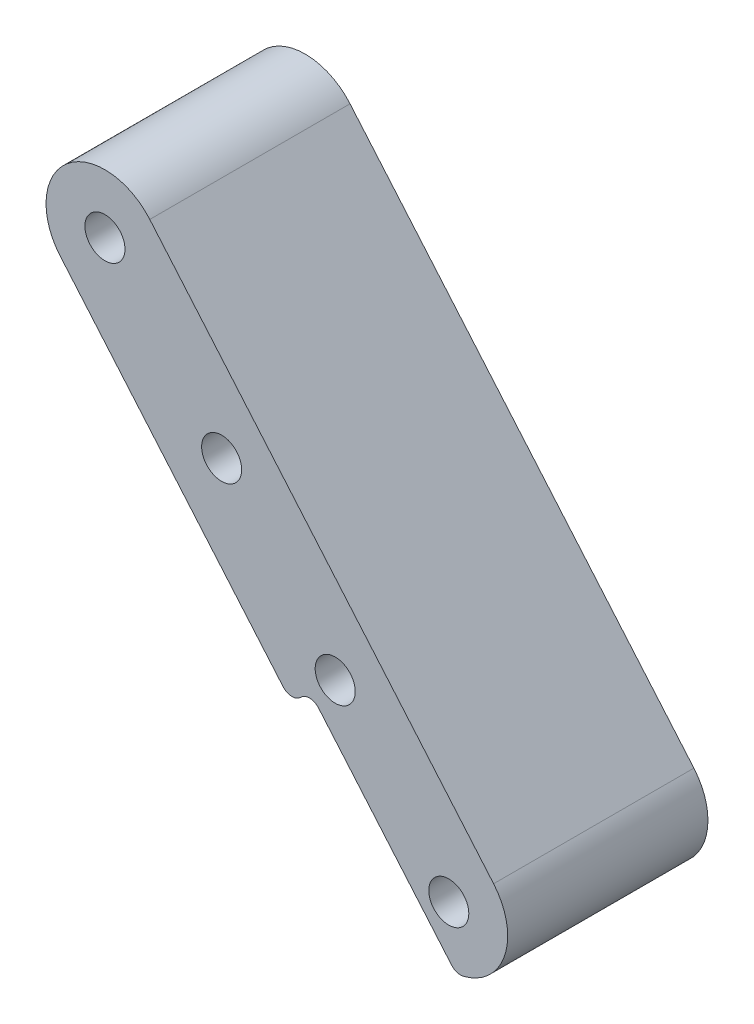
ISO-10303-21;
HEADER;
FILE_DESCRIPTION(('STEP AP214'),'2;1');
FILE_NAME('part.step','',(''),(''),'','','');
FILE_SCHEMA(('AUTOMOTIVE_DESIGN { 1 0 10303 214 1 1 1 1 }'));
ENDSEC;
DATA;
#1=APPLICATION_CONTEXT('core data for automotive mechanical design processes');
#2=APPLICATION_PROTOCOL_DEFINITION('international standard','automotive_design',2000,#1);
#3=PRODUCT_CONTEXT('',#1,'mechanical');
#4=PRODUCT('Part','Part','',(#3));
#5=PRODUCT_RELATED_PRODUCT_CATEGORY('part','',(#4));
#6=PRODUCT_DEFINITION_FORMATION('','',#4);
#7=PRODUCT_DEFINITION_CONTEXT('part definition',#1,'design');
#8=PRODUCT_DEFINITION('design','',#6,#7);
#9=PRODUCT_DEFINITION_SHAPE('','',#8);
#10=(LENGTH_UNIT() NAMED_UNIT(*) SI_UNIT(.MILLI.,.METRE.));
#11=(NAMED_UNIT(*) PLANE_ANGLE_UNIT() SI_UNIT($,.RADIAN.));
#12=(NAMED_UNIT(*) SI_UNIT($,.STERADIAN.) SOLID_ANGLE_UNIT());
#13=UNCERTAINTY_MEASURE_WITH_UNIT(LENGTH_MEASURE(1.E-05),#10,'distance_accuracy_value','');
#14=(GEOMETRIC_REPRESENTATION_CONTEXT(3) GLOBAL_UNCERTAINTY_ASSIGNED_CONTEXT((#13)) GLOBAL_UNIT_ASSIGNED_CONTEXT((#10,
#11,#12)) REPRESENTATION_CONTEXT('',''));
#15=CARTESIAN_POINT('',(0.,0.,0.));
#16=DIRECTION('',(0.,0.,1.));
#17=DIRECTION('',(1.,0.,0.));
#18=AXIS2_PLACEMENT_3D('',#15,#16,#17);
#19=CARTESIAN_POINT('',(-10.203207624469,-8.69654423782736,34.));
#20=DIRECTION('',(0.761061934171293,0.648679221461156,0.));
#21=DIRECTION('',(-0.648679221461156,0.761061934171293,0.));
#22=AXIS2_PLACEMENT_3D('',#19,#20,#21);
#23=PLANE('',#22);
#24=DIRECTION('',(0.648679221461156,-0.761061934171293,0.));
#25=VECTOR('',#24,1.);
#26=CARTESIAN_POINT('',(-10.203207624469,-8.69654423782736,0.));
#27=LINE('',#26,#25);
#28=CARTESIAN_POINT('',(26.1104587089052,-51.301499386963,0.));
#29=VERTEX_POINT('',#28);
#30=CARTESIAN_POINT('',(63.9584834494718,-95.7066382608978,0.));
#31=VERTEX_POINT('',#30);
#32=EDGE_CURVE('E177',#29,#31,#27,.T.);
#33=ORIENTED_EDGE('',*,*,#32,.T.);
#34=DIRECTION('',(0.,0.,1.));
#35=VECTOR('',#34,1.);
#36=CARTESIAN_POINT('',(63.9584834494718,-95.7066382608978,34.));
#37=LINE('',#36,#35);
#38=CARTESIAN_POINT('',(63.9584834494718,-95.7066382608978,34.));
#39=VERTEX_POINT('',#38);
#40=EDGE_CURVE('E144',#31,#39,#37,.T.);
#41=ORIENTED_EDGE('',*,*,#40,.T.);
#42=DIRECTION('',(0.648679221461156,-0.761061934171293,0.));
#43=VECTOR('',#42,1.);
#44=CARTESIAN_POINT('',(-10.203207624469,-8.69654423782736,34.));
#45=LINE('',#44,#43);
#46=CARTESIAN_POINT('',(26.1104587089052,-51.301499386963,34.));
#47=VERTEX_POINT('',#46);
#48=EDGE_CURVE('E134',#47,#39,#45,.T.);
#49=ORIENTED_EDGE('',*,*,#48,.F.);
#50=DIRECTION('',(0.,0.,-1.));
#51=VECTOR('',#50,1.);
#52=CARTESIAN_POINT('',(26.1104587089052,-51.301499386963,34.));
#53=LINE('',#52,#51);
#54=EDGE_CURVE('E156',#47,#29,#53,.T.);
#55=ORIENTED_EDGE('',*,*,#54,.T.);
#56=EDGE_LOOP('',(#33,#41,#49,#55));
#57=FACE_BOUND('',#56,.T.);
#58=ADVANCED_FACE('F49',(#57),#23,.F.);
#59=CARTESIAN_POINT('',(92.0987320713913,-113.30620314066,34.));
#60=DIRECTION('',(0.,0.,-1.));
#61=DIRECTION('',(-1.,0.,0.));
#62=AXIS2_PLACEMENT_3D('',#59,#60,#61);
#63=CYLINDRICAL_SURFACE('',#62,9.99999999999999);
#64=CARTESIAN_POINT('',(92.0987320713913,-113.30620314066,34.));
#65=DIRECTION('',(0.,0.,1.));
#66=DIRECTION('',(1.,0.,0.));
#67=AXIS2_PLACEMENT_3D('',#64,#65,#66);
#68=CIRCLE('',#67,9.99999999999999);
#69=CARTESIAN_POINT('',(94.6021290946444,-122.98778376285,34.));
#70=VERTEX_POINT('',#69);
#71=CARTESIAN_POINT('',(99.7093514131042,-106.819410926048,34.));
#72=VERTEX_POINT('',#71);
#73=EDGE_CURVE('E122',#70,#72,#68,.T.);
#74=ORIENTED_EDGE('',*,*,#73,.F.);
#75=DIRECTION('',(0.,0.,-1.));
#76=VECTOR('',#75,1.);
#77=CARTESIAN_POINT('',(94.6021290946444,-122.98778376285,34.));
#78=LINE('',#77,#76);
#79=CARTESIAN_POINT('',(94.6021290946444,-122.98778376285,0.));
#80=VERTEX_POINT('',#79);
#81=EDGE_CURVE('E219',#70,#80,#78,.T.);
#82=ORIENTED_EDGE('',*,*,#81,.T.);
#83=CARTESIAN_POINT('',(92.0987320713913,-113.30620314066,0.));
#84=DIRECTION('',(0.,0.,1.));
#85=DIRECTION('',(1.,0.,0.));
#86=AXIS2_PLACEMENT_3D('',#83,#84,#85);
#87=CIRCLE('',#86,9.99999999999999);
#88=CARTESIAN_POINT('',(99.7093514131042,-106.819410926048,0.));
#89=VERTEX_POINT('',#88);
#90=EDGE_CURVE('E139',#80,#89,#87,.T.);
#91=ORIENTED_EDGE('',*,*,#90,.T.);
#92=DIRECTION('',(0.,0.,-1.));
#93=VECTOR('',#92,1.);
#94=CARTESIAN_POINT('',(99.7093514131042,-106.819410926048,34.));
#95=LINE('',#94,#93);
#96=EDGE_CURVE('E137',#72,#89,#95,.T.);
#97=ORIENTED_EDGE('',*,*,#96,.F.);
#98=EDGE_LOOP('',(#74,#82,#91,#97));
#99=FACE_BOUND('',#98,.T.);
#100=ADVANCED_FACE('F138',(#99),#63,.T.);
#101=CARTESIAN_POINT('',(5.01803105895681,4.27704019139575,34.));
#102=DIRECTION('',(0.761061934171293,0.648679221461156,0.));
#103=DIRECTION('',(-0.648679221461156,0.761061934171293,0.));
#104=AXIS2_PLACEMENT_3D('',#101,#102,#103);
#105=PLANE('',#104);
#106=DIRECTION('',(0.648679221461156,-0.761061934171293,0.));
#107=VECTOR('',#106,1.);
#108=CARTESIAN_POINT('',(5.01803105895681,4.27704019139575,0.));
#109=LINE('',#108,#107);
#110=CARTESIAN_POINT('',(41.3316973923311,-38.3279149577399,0.));
#111=VERTEX_POINT('',#110);
#112=EDGE_CURVE('E182',#111,#89,#109,.T.);
#113=ORIENTED_EDGE('',*,*,#112,.F.);
#114=DIRECTION('',(0.,0.,-1.));
#115=VECTOR('',#114,1.);
#116=CARTESIAN_POINT('',(41.3316973923311,-38.3279149577399,34.));
#117=LINE('',#116,#115);
#118=CARTESIAN_POINT('',(41.3316973923311,-38.3279149577399,34.));
#119=VERTEX_POINT('',#118);
#120=EDGE_CURVE('E145',#119,#111,#117,.T.);
#121=ORIENTED_EDGE('',*,*,#120,.F.);
#122=DIRECTION('',(0.648679221461156,-0.761061934171293,0.));
#123=VECTOR('',#122,1.);
#124=CARTESIAN_POINT('',(5.01803105895681,4.27704019139575,34.));
#125=LINE('',#124,#123);
#126=EDGE_CURVE('E128',#119,#72,#125,.T.);
#127=ORIENTED_EDGE('',*,*,#126,.T.);
#128=ORIENTED_EDGE('',*,*,#96,.T.);
#129=EDGE_LOOP('',(#113,#121,#127,#128));
#130=FACE_BOUND('',#129,.T.);
#131=ADVANCED_FACE('F147',(#130),#105,.T.);
#132=CARTESIAN_POINT('',(33.7210780506182,-44.8147071723515,34.));
#133=DIRECTION('',(0.,0.,-1.));
#134=DIRECTION('',(-1.,0.,0.));
#135=AXIS2_PLACEMENT_3D('',#132,#133,#134);
#136=CYLINDRICAL_SURFACE('',#135,3.4);
#137=CARTESIAN_POINT('',(33.7210780506182,-44.8147071723515,34.));
#138=DIRECTION('',(0.,0.,1.));
#139=DIRECTION('',(1.,0.,0.));
#140=AXIS2_PLACEMENT_3D('',#137,#138,#139);
#141=CIRCLE('',#140,3.4);
#142=CARTESIAN_POINT('',(37.1210780506182,-44.8147071723515,34.));
#143=VERTEX_POINT('',#142);
#144=EDGE_CURVE('E262',#143,#143,#141,.T.);
#145=ORIENTED_EDGE('',*,*,#144,.T.);
#146=EDGE_LOOP('',(#145));
#147=FACE_BOUND('',#146,.T.);
#148=CARTESIAN_POINT('',(33.7210780506182,-44.8147071723515,0.));
#149=DIRECTION('',(0.,0.,1.));
#150=DIRECTION('',(1.,0.,0.));
#151=AXIS2_PLACEMENT_3D('',#148,#149,#150);
#152=CIRCLE('',#151,3.4);
#153=CARTESIAN_POINT('',(37.1210780506182,-44.8147071723515,0.));
#154=VERTEX_POINT('',#153);
#155=EDGE_CURVE('E173',#154,#154,#152,.T.);
#156=ORIENTED_EDGE('',*,*,#155,.F.);
#157=EDGE_LOOP('',(#156));
#158=FACE_BOUND('',#157,.T.);
#159=ADVANCED_FACE('F296',(#147,#158),#136,.F.);
#160=CARTESIAN_POINT('',(53.5314754901986,-67.3435365535214,34.));
#161=DIRECTION('',(0.,0.,-1.));
#162=DIRECTION('',(-1.,0.,0.));
#163=AXIS2_PLACEMENT_3D('',#160,#161,#162);
#164=CYLINDRICAL_SURFACE('',#163,3.4);
#165=CARTESIAN_POINT('',(53.5314754901986,-67.3435365535214,34.));
#166=DIRECTION('',(0.,0.,1.));
#167=DIRECTION('',(1.,0.,0.));
#168=AXIS2_PLACEMENT_3D('',#165,#166,#167);
#169=CIRCLE('',#168,3.4);
#170=CARTESIAN_POINT('',(56.9314754901986,-67.3435365535214,34.));
#171=VERTEX_POINT('',#170);
#172=EDGE_CURVE('E258',#171,#171,#169,.T.);
#173=ORIENTED_EDGE('',*,*,#172,.T.);
#174=EDGE_LOOP('',(#173));
#175=FACE_BOUND('',#174,.T.);
#176=CARTESIAN_POINT('',(53.5314754901986,-67.3435365535214,0.));
#177=DIRECTION('',(0.,0.,1.));
#178=DIRECTION('',(1.,0.,0.));
#179=AXIS2_PLACEMENT_3D('',#176,#177,#178);
#180=CIRCLE('',#179,3.4);
#181=CARTESIAN_POINT('',(56.9314754901986,-67.3435365535214,0.));
#182=VERTEX_POINT('',#181);
#183=EDGE_CURVE('E169',#182,#182,#180,.T.);
#184=ORIENTED_EDGE('',*,*,#183,.F.);
#185=EDGE_LOOP('',(#184));
#186=FACE_BOUND('',#185,.T.);
#187=ADVANCED_FACE('F299',(#175,#186),#164,.F.);
#188=CARTESIAN_POINT('',(92.0987320713913,-113.30620314066,34.));
#189=DIRECTION('',(0.,0.,-1.));
#190=DIRECTION('',(-1.,0.,0.));
#191=AXIS2_PLACEMENT_3D('',#188,#189,#190);
#192=CYLINDRICAL_SURFACE('',#191,3.4);
#193=CARTESIAN_POINT('',(92.0987320713913,-113.30620314066,34.));
#194=DIRECTION('',(0.,0.,1.));
#195=DIRECTION('',(1.,0.,0.));
#196=AXIS2_PLACEMENT_3D('',#193,#194,#195);
#197=CIRCLE('',#196,3.4);
#198=CARTESIAN_POINT('',(95.4987320713913,-113.30620314066,34.));
#199=VERTEX_POINT('',#198);
#200=EDGE_CURVE('E254',#199,#199,#197,.T.);
#201=ORIENTED_EDGE('',*,*,#200,.T.);
#202=EDGE_LOOP('',(#201));
#203=FACE_BOUND('',#202,.T.);
#204=CARTESIAN_POINT('',(92.0987320713913,-113.30620314066,0.));
#205=DIRECTION('',(0.,0.,1.));
#206=DIRECTION('',(1.,0.,0.));
#207=AXIS2_PLACEMENT_3D('',#204,#205,#206);
#208=CIRCLE('',#207,3.4);
#209=CARTESIAN_POINT('',(95.4987320713913,-113.30620314066,0.));
#210=VERTEX_POINT('',#209);
#211=EDGE_CURVE('E164',#210,#210,#208,.T.);
#212=ORIENTED_EDGE('',*,*,#211,.F.);
#213=EDGE_LOOP('',(#212));
#214=FACE_BOUND('',#213,.T.);
#215=ADVANCED_FACE('F284',(#203,#214),#192,.F.);
#216=CARTESIAN_POINT('',(72.8151037807949,-90.3248698470906,34.));
#217=DIRECTION('',(0.,0.,-1.));
#218=DIRECTION('',(-1.,0.,0.));
#219=AXIS2_PLACEMENT_3D('',#216,#217,#218);
#220=CYLINDRICAL_SURFACE('',#219,3.4);
#221=CARTESIAN_POINT('',(72.8151037807949,-90.3248698470906,34.));
#222=DIRECTION('',(0.,0.,1.));
#223=DIRECTION('',(1.,0.,0.));
#224=AXIS2_PLACEMENT_3D('',#221,#222,#223);
#225=CIRCLE('',#224,3.4);
#226=CARTESIAN_POINT('',(76.2151037807949,-90.3248698470906,34.));
#227=VERTEX_POINT('',#226);
#228=EDGE_CURVE('E188',#227,#227,#225,.T.);
#229=ORIENTED_EDGE('',*,*,#228,.T.);
#230=EDGE_LOOP('',(#229));
#231=FACE_BOUND('',#230,.T.);
#232=CARTESIAN_POINT('',(72.8151037807949,-90.3248698470906,0.));
#233=DIRECTION('',(0.,0.,1.));
#234=DIRECTION('',(1.,0.,0.));
#235=AXIS2_PLACEMENT_3D('',#232,#233,#234);
#236=CIRCLE('',#235,3.4);
#237=CARTESIAN_POINT('',(76.2151037807949,-90.3248698470906,0.));
#238=VERTEX_POINT('',#237);
#239=EDGE_CURVE('E160',#238,#238,#236,.T.);
#240=ORIENTED_EDGE('',*,*,#239,.F.);
#241=EDGE_LOOP('',(#240));
#242=FACE_BOUND('',#241,.T.);
#243=ADVANCED_FACE('F277',(#231,#242),#220,.F.);
#244=CARTESIAN_POINT('',(33.7210780506182,-44.8147071723515,34.));
#245=DIRECTION('',(0.,0.,-1.));
#246=DIRECTION('',(-1.,0.,0.));
#247=AXIS2_PLACEMENT_3D('',#244,#245,#246);
#248=CYLINDRICAL_SURFACE('',#247,10.);
#249=CARTESIAN_POINT('',(33.7210780506182,-44.8147071723515,0.));
#250=DIRECTION('',(0.,0.,1.));
#251=DIRECTION('',(1.,0.,0.));
#252=AXIS2_PLACEMENT_3D('',#249,#250,#251);
#253=CIRCLE('',#252,10.);
#254=EDGE_CURVE('E185',#111,#29,#253,.T.);
#255=ORIENTED_EDGE('',*,*,#254,.T.);
#256=ORIENTED_EDGE('',*,*,#54,.F.);
#257=CARTESIAN_POINT('',(33.7210780506182,-44.8147071723515,34.));
#258=DIRECTION('',(0.,0.,1.));
#259=DIRECTION('',(1.,0.,0.));
#260=AXIS2_PLACEMENT_3D('',#257,#258,#259);
#261=CIRCLE('',#260,10.);
#262=EDGE_CURVE('E150',#119,#47,#261,.T.);
#263=ORIENTED_EDGE('',*,*,#262,.F.);
#264=ORIENTED_EDGE('',*,*,#120,.T.);
#265=EDGE_LOOP('',(#255,#256,#263,#264));
#266=FACE_BOUND('',#265,.T.);
#267=ADVANCED_FACE('F275',(#266),#248,.T.);
#268=CARTESIAN_POINT('',(0.,0.,34.));
#269=DIRECTION('',(0.,0.,1.));
#270=DIRECTION('',(1.,0.,0.));
#271=AXIS2_PLACEMENT_3D('',#268,#269,#270);
#272=PLANE('',#271);
#273=ORIENTED_EDGE('',*,*,#48,.T.);
#274=CARTESIAN_POINT('',(65.4806073178143,-94.4092798179755,34.));
#275=DIRECTION('',(0.,0.,1.));
#276=DIRECTION('',(1.,0.,0.));
#277=AXIS2_PLACEMENT_3D('',#274,#275,#276);
#278=CIRCLE('',#277,2.);
#279=CARTESIAN_POINT('',(66.7779657607367,-95.9314036863181,34.));
#280=VERTEX_POINT('',#279);
#281=EDGE_CURVE('E198',#39,#280,#278,.T.);
#282=ORIENTED_EDGE('',*,*,#281,.T.);
#283=DIRECTION('',(-0.761061934171288,-0.648679221461162,0.));
#284=VECTOR('',#283,1.);
#285=CARTESIAN_POINT('',(75.4590495168638,-88.5322178914124,34.));
#286=LINE('',#285,#284);
#287=CARTESIAN_POINT('',(67.1584967278223,-95.6070640755875,34.));
#288=VERTEX_POINT('',#287);
#289=EDGE_CURVE('E227',#288,#280,#286,.T.);
#290=ORIENTED_EDGE('',*,*,#289,.F.);
#291=CARTESIAN_POINT('',(68.4558551707446,-97.1291879439301,34.));
#292=DIRECTION('',(0.,0.,1.));
#293=DIRECTION('',(1.,0.,0.));
#294=AXIS2_PLACEMENT_3D('',#291,#292,#293);
#295=CIRCLE('',#294,2.);
#296=CARTESIAN_POINT('',(69.9779790390872,-95.8318295010078,34.));
#297=VERTEX_POINT('',#296);
#298=EDGE_CURVE('E58',#288,#297,#295,.F.);
#299=ORIENTED_EDGE('',*,*,#298,.T.);
#300=DIRECTION('',(-0.648679221461155,0.761061934171293,0.));
#301=VECTOR('',#300,1.);
#302=CARTESIAN_POINT('',(-6.77842892069819,-5.77748774125213,34.));
#303=LINE('',#302,#301);
#304=CARTESIAN_POINT('',(92.5793258216512,-122.348826081334,34.));
#305=VERTEX_POINT('',#304);
#306=EDGE_CURVE('E225',#305,#297,#303,.T.);
#307=ORIENTED_EDGE('',*,*,#306,.F.);
#308=CARTESIAN_POINT('',(94.1014496899938,-121.051467638412,34.));
#309=DIRECTION('',(0.,0.,1.));
#310=DIRECTION('',(1.,0.,0.));
#311=AXIS2_PLACEMENT_3D('',#308,#309,#310);
#312=CIRCLE('',#311,2.);
#313=EDGE_CURVE('E130',#305,#70,#312,.T.);
#314=ORIENTED_EDGE('',*,*,#313,.T.);
#315=ORIENTED_EDGE('',*,*,#73,.T.);
#316=ORIENTED_EDGE('',*,*,#126,.F.);
#317=ORIENTED_EDGE('',*,*,#262,.T.);
#318=EDGE_LOOP('',(#273,#282,#290,#299,#307,#314,#315,#316,#317));
#319=FACE_BOUND('',#318,.T.);
#320=ORIENTED_EDGE('',*,*,#228,.F.);
#321=EDGE_LOOP('',(#320));
#322=FACE_BOUND('',#321,.T.);
#323=ORIENTED_EDGE('',*,*,#200,.F.);
#324=EDGE_LOOP('',(#323));
#325=FACE_BOUND('',#324,.T.);
#326=ORIENTED_EDGE('',*,*,#172,.F.);
#327=EDGE_LOOP('',(#326));
#328=FACE_BOUND('',#327,.T.);
#329=ORIENTED_EDGE('',*,*,#144,.F.);
#330=EDGE_LOOP('',(#329));
#331=FACE_BOUND('',#330,.T.);
#332=ADVANCED_FACE('F125',(#319,#322,#325,#328,#331),#272,.T.);
#333=CARTESIAN_POINT('',(0.,0.,0.));
#334=DIRECTION('',(0.,0.,1.));
#335=DIRECTION('',(1.,0.,0.));
#336=AXIS2_PLACEMENT_3D('',#333,#334,#335);
#337=PLANE('',#336);
#338=ORIENTED_EDGE('',*,*,#239,.T.);
#339=EDGE_LOOP('',(#338));
#340=FACE_BOUND('',#339,.T.);
#341=ORIENTED_EDGE('',*,*,#211,.T.);
#342=EDGE_LOOP('',(#341));
#343=FACE_BOUND('',#342,.T.);
#344=ORIENTED_EDGE('',*,*,#183,.T.);
#345=EDGE_LOOP('',(#344));
#346=FACE_BOUND('',#345,.T.);
#347=ORIENTED_EDGE('',*,*,#155,.T.);
#348=EDGE_LOOP('',(#347));
#349=FACE_BOUND('',#348,.T.);
#350=DIRECTION('',(-0.761061934171288,-0.648679221461162,0.));
#351=VECTOR('',#350,1.);
#352=CARTESIAN_POINT('',(75.4590495168638,-88.5322178914124,0.));
#353=LINE('',#352,#351);
#354=CARTESIAN_POINT('',(67.1584967278223,-95.6070640755875,0.));
#355=VERTEX_POINT('',#354);
#356=CARTESIAN_POINT('',(66.7779657607367,-95.9314036863181,0.));
#357=VERTEX_POINT('',#356);
#358=EDGE_CURVE('E165',#355,#357,#353,.T.);
#359=ORIENTED_EDGE('',*,*,#358,.T.);
#360=CARTESIAN_POINT('',(65.4806073178143,-94.4092798179755,0.));
#361=DIRECTION('',(0.,0.,1.));
#362=DIRECTION('',(1.,0.,0.));
#363=AXIS2_PLACEMENT_3D('',#360,#361,#362);
#364=CIRCLE('',#363,2.);
#365=EDGE_CURVE('E210',#357,#31,#364,.F.);
#366=ORIENTED_EDGE('',*,*,#365,.T.);
#367=ORIENTED_EDGE('',*,*,#32,.F.);
#368=ORIENTED_EDGE('',*,*,#254,.F.);
#369=ORIENTED_EDGE('',*,*,#112,.T.);
#370=ORIENTED_EDGE('',*,*,#90,.F.);
#371=CARTESIAN_POINT('',(94.1014496899938,-121.051467638412,0.));
#372=DIRECTION('',(0.,0.,1.));
#373=DIRECTION('',(1.,0.,0.));
#374=AXIS2_PLACEMENT_3D('',#371,#372,#373);
#375=CIRCLE('',#374,2.);
#376=CARTESIAN_POINT('',(92.5793258216512,-122.348826081334,0.));
#377=VERTEX_POINT('',#376);
#378=EDGE_CURVE('E72',#80,#377,#375,.F.);
#379=ORIENTED_EDGE('',*,*,#378,.T.);
#380=DIRECTION('',(-0.648679221461155,0.761061934171293,0.));
#381=VECTOR('',#380,1.);
#382=CARTESIAN_POINT('',(-6.77842892069819,-5.77748774125213,0.));
#383=LINE('',#382,#381);
#384=CARTESIAN_POINT('',(69.9779790390872,-95.8318295010078,0.));
#385=VERTEX_POINT('',#384);
#386=EDGE_CURVE('E239',#377,#385,#383,.T.);
#387=ORIENTED_EDGE('',*,*,#386,.T.);
#388=CARTESIAN_POINT('',(68.4558551707446,-97.1291879439301,0.));
#389=DIRECTION('',(0.,0.,1.));
#390=DIRECTION('',(1.,0.,0.));
#391=AXIS2_PLACEMENT_3D('',#388,#389,#390);
#392=CIRCLE('',#391,2.);
#393=EDGE_CURVE('E11',#385,#355,#392,.T.);
#394=ORIENTED_EDGE('',*,*,#393,.T.);
#395=EDGE_LOOP('',(#359,#366,#367,#368,#369,#370,#379,#387,#394));
#396=FACE_BOUND('',#395,.T.);
#397=ADVANCED_FACE('F237',(#340,#343,#346,#349,#396),#337,.F.);
#398=CARTESIAN_POINT('',(-6.77842892069819,-5.77748774125213,0.));
#399=DIRECTION('',(0.761061934171293,0.648679221461155,0.));
#400=DIRECTION('',(-0.648679221461155,0.761061934171293,0.));
#401=AXIS2_PLACEMENT_3D('',#398,#399,#400);
#402=PLANE('',#401);
#403=ORIENTED_EDGE('',*,*,#386,.F.);
#404=DIRECTION('',(0.,0.,-1.));
#405=VECTOR('',#404,1.);
#406=CARTESIAN_POINT('',(92.5793258216512,-122.348826081334,0.));
#407=LINE('',#406,#405);
#408=EDGE_CURVE('E215',#377,#305,#407,.F.);
#409=ORIENTED_EDGE('',*,*,#408,.T.);
#410=ORIENTED_EDGE('',*,*,#306,.T.);
#411=DIRECTION('',(0.,0.,1.));
#412=VECTOR('',#411,1.);
#413=CARTESIAN_POINT('',(69.9779790390872,-95.8318295010078,0.));
#414=LINE('',#413,#412);
#415=EDGE_CURVE('E65',#297,#385,#414,.F.);
#416=ORIENTED_EDGE('',*,*,#415,.T.);
#417=EDGE_LOOP('',(#403,#409,#410,#416));
#418=FACE_BOUND('',#417,.T.);
#419=ADVANCED_FACE('F230',(#418),#402,.F.);
#420=CARTESIAN_POINT('',(75.4590495168638,-88.5322178914124,0.));
#421=DIRECTION('',(-0.648679221461162,0.761061934171288,0.));
#422=DIRECTION('',(-0.761061934171288,-0.648679221461162,0.));
#423=AXIS2_PLACEMENT_3D('',#420,#421,#422);
#424=PLANE('',#423);
#425=ORIENTED_EDGE('',*,*,#289,.T.);
#426=DIRECTION('',(0.,0.,1.));
#427=VECTOR('',#426,1.);
#428=CARTESIAN_POINT('',(66.7779657607367,-95.9314036863181,0.));
#429=LINE('',#428,#427);
#430=EDGE_CURVE('E205',#280,#357,#429,.F.);
#431=ORIENTED_EDGE('',*,*,#430,.T.);
#432=ORIENTED_EDGE('',*,*,#358,.F.);
#433=DIRECTION('',(0.,0.,1.));
#434=VECTOR('',#433,1.);
#435=CARTESIAN_POINT('',(67.1584967278223,-95.6070640755875,34.));
#436=LINE('',#435,#434);
#437=EDGE_CURVE('E201',#355,#288,#436,.T.);
#438=ORIENTED_EDGE('',*,*,#437,.T.);
#439=EDGE_LOOP('',(#425,#431,#432,#438));
#440=FACE_BOUND('',#439,.T.);
#441=ADVANCED_FACE('F241',(#440),#424,.F.);
#442=CARTESIAN_POINT('',(65.4806073178143,-94.4092798179755,34.));
#443=DIRECTION('',(0.,0.,1.));
#444=DIRECTION('',(1.,0.,0.));
#445=AXIS2_PLACEMENT_3D('',#442,#443,#444);
#446=CYLINDRICAL_SURFACE('',#445,2.);
#447=ORIENTED_EDGE('',*,*,#365,.F.);
#448=ORIENTED_EDGE('',*,*,#430,.F.);
#449=ORIENTED_EDGE('',*,*,#281,.F.);
#450=ORIENTED_EDGE('',*,*,#40,.F.);
#451=EDGE_LOOP('',(#447,#448,#449,#450));
#452=FACE_BOUND('',#451,.T.);
#453=ADVANCED_FACE('F272',(#452),#446,.T.);
#454=CARTESIAN_POINT('',(94.1014496899938,-121.051467638412,34.));
#455=DIRECTION('',(0.,0.,-1.));
#456=DIRECTION('',(-1.,0.,0.));
#457=AXIS2_PLACEMENT_3D('',#454,#455,#456);
#458=CYLINDRICAL_SURFACE('',#457,2.);
#459=ORIENTED_EDGE('',*,*,#378,.F.);
#460=ORIENTED_EDGE('',*,*,#81,.F.);
#461=ORIENTED_EDGE('',*,*,#313,.F.);
#462=ORIENTED_EDGE('',*,*,#408,.F.);
#463=EDGE_LOOP('',(#459,#460,#461,#462));
#464=FACE_BOUND('',#463,.T.);
#465=ADVANCED_FACE('F308',(#464),#458,.T.);
#466=CARTESIAN_POINT('',(68.4558551707446,-97.1291879439301,0.));
#467=DIRECTION('',(0.,0.,-1.));
#468=DIRECTION('',(-1.,0.,0.));
#469=AXIS2_PLACEMENT_3D('',#466,#467,#468);
#470=CYLINDRICAL_SURFACE('',#469,2.);
#471=ORIENTED_EDGE('',*,*,#393,.F.);
#472=ORIENTED_EDGE('',*,*,#415,.F.);
#473=ORIENTED_EDGE('',*,*,#298,.F.);
#474=ORIENTED_EDGE('',*,*,#437,.F.);
#475=EDGE_LOOP('',(#471,#472,#473,#474));
#476=FACE_BOUND('',#475,.T.);
#477=ADVANCED_FACE('F51',(#476),#470,.F.);
#478=CLOSED_SHELL('',(#58,#100,#131,#159,#187,#215,#243,#267,#332,#397,#419,#441,#453,#465,#477));
#479=MANIFOLD_SOLID_BREP('B2',#478);
#480=ADVANCED_BREP_SHAPE_REPRESENTATION('',(#18,#479),#14);
#481=SHAPE_DEFINITION_REPRESENTATION(#9,#480);
ENDSEC;
END-ISO-10303-21;
